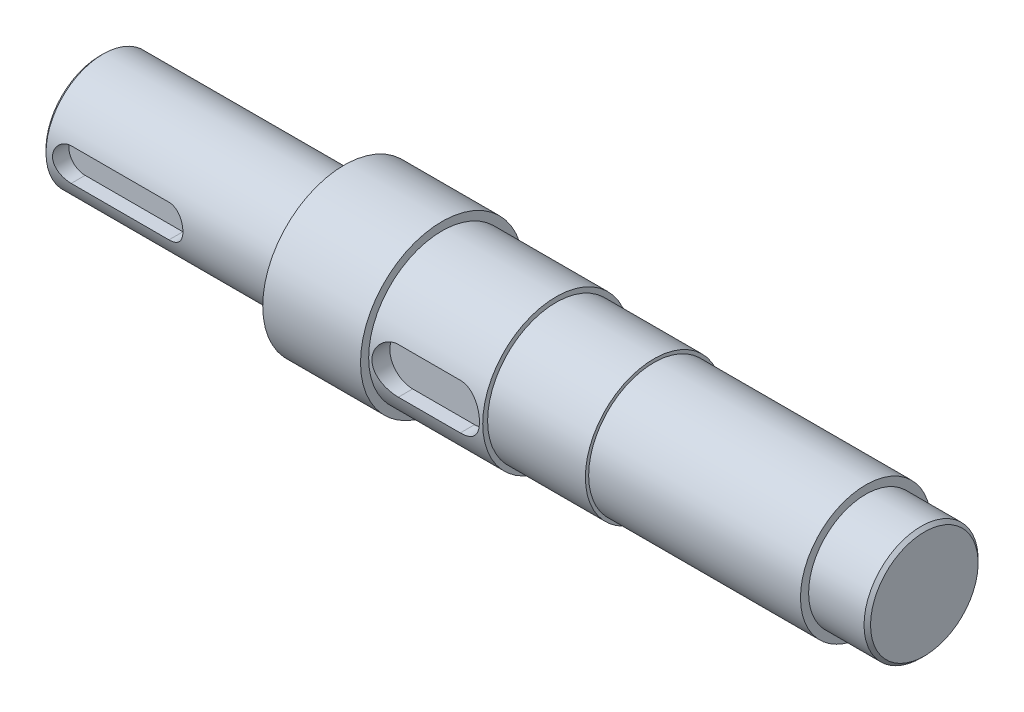
ISO-10303-21;
HEADER;
FILE_DESCRIPTION(('STEP AP214'),'2;1');
FILE_NAME('part.step','',(''),(''),'','','');
FILE_SCHEMA(('AUTOMOTIVE_DESIGN { 1 0 10303 214 1 1 1 1 }'));
ENDSEC;
DATA;
#1=APPLICATION_CONTEXT('core data for automotive mechanical design processes');
#2=APPLICATION_PROTOCOL_DEFINITION('international standard','automotive_design',2000,#1);
#3=PRODUCT_CONTEXT('',#1,'mechanical');
#4=PRODUCT('Part','Part','',(#3));
#5=PRODUCT_RELATED_PRODUCT_CATEGORY('part','',(#4));
#6=PRODUCT_DEFINITION_FORMATION('','',#4);
#7=PRODUCT_DEFINITION_CONTEXT('part definition',#1,'design');
#8=PRODUCT_DEFINITION('design','',#6,#7);
#9=PRODUCT_DEFINITION_SHAPE('','',#8);
#10=(LENGTH_UNIT() NAMED_UNIT(*) SI_UNIT(.MILLI.,.METRE.));
#11=(NAMED_UNIT(*) PLANE_ANGLE_UNIT() SI_UNIT($,.RADIAN.));
#12=(NAMED_UNIT(*) SI_UNIT($,.STERADIAN.) SOLID_ANGLE_UNIT());
#13=UNCERTAINTY_MEASURE_WITH_UNIT(LENGTH_MEASURE(1.E-05),#10,'distance_accuracy_value','');
#14=(GEOMETRIC_REPRESENTATION_CONTEXT(3) GLOBAL_UNCERTAINTY_ASSIGNED_CONTEXT((#13)) GLOBAL_UNIT_ASSIGNED_CONTEXT((#10,
#11,#12)) REPRESENTATION_CONTEXT('',''));
#15=CARTESIAN_POINT('',(0.,0.,0.));
#16=DIRECTION('',(0.,0.,1.));
#17=DIRECTION('',(1.,0.,0.));
#18=AXIS2_PLACEMENT_3D('',#15,#16,#17);
#19=CARTESIAN_POINT('',(0.,0.,0.));
#20=DIRECTION('',(-1.,0.,0.));
#21=DIRECTION('',(0.,0.,1.));
#22=AXIS2_PLACEMENT_3D('',#19,#20,#21);
#23=CYLINDRICAL_SURFACE('',#22,17.5);
#24=CARTESIAN_POINT('',(1.00000000000007,0.,0.));
#25=DIRECTION('',(1.,0.,0.));
#26=DIRECTION('',(0.,0.,-1.));
#27=AXIS2_PLACEMENT_3D('',#24,#25,#26);
#28=CIRCLE('',#27,17.5);
#29=CARTESIAN_POINT('',(1.00000000000007,0.,-17.5));
#30=VERTEX_POINT('',#29);
#31=EDGE_CURVE('E13',#30,#30,#28,.T.);
#32=ORIENTED_EDGE('',*,*,#31,.T.);
#33=EDGE_LOOP('',(#32));
#34=FACE_BOUND('',#33,.T.);
#35=CARTESIAN_POINT('',(75.,0.,0.));
#36=DIRECTION('',(-1.,0.,0.));
#37=DIRECTION('',(0.,0.,1.));
#38=AXIS2_PLACEMENT_3D('',#35,#36,#37);
#39=CIRCLE('',#38,17.5);
#40=CARTESIAN_POINT('',(75.,0.,17.5));
#41=VERTEX_POINT('',#40);
#42=EDGE_CURVE('E206',#41,#41,#39,.T.);
#43=ORIENTED_EDGE('',*,*,#42,.T.);
#44=EDGE_LOOP('',(#43));
#45=FACE_BOUND('',#44,.T.);
#46=CARTESIAN_POINT('',(8.,5.,16.7705098312484));
#47=CARTESIAN_POINT('',(7.86245623305314,5.00001814544053,16.7704912725158));
#48=CARTESIAN_POINT('',(7.7249193779771,4.99432529208164,16.7722013219269));
#49=CARTESIAN_POINT('',(7.45088881071556,4.97165222541634,16.7789431019967));
#50=CARTESIAN_POINT('',(7.31439488815721,4.95467435267923,16.7839741438635));
#51=CARTESIAN_POINT('',(7.04374154598052,4.90961903685605,16.7972068372471));
#52=CARTESIAN_POINT('',(6.90957737516665,4.88156789644729,16.8054009743523));
#53=CARTESIAN_POINT('',(6.64420035801123,4.81461674604718,16.8247046364186));
#54=CARTESIAN_POINT('',(6.51298757757802,4.77571649404059,16.8358142264156));
#55=CARTESIAN_POINT('',(6.25446833937773,4.68740449021953,16.8606149796878));
#56=CARTESIAN_POINT('',(6.12715994463595,4.63799805032664,16.874304837985));
#57=CARTESIAN_POINT('',(5.87720063727427,4.52905522001708,16.9038705765848));
#58=CARTESIAN_POINT('',(5.75455147662851,4.46951506432954,16.9197472690052));
#59=CARTESIAN_POINT('',(5.39479163969302,4.27631278448765,16.9699997678901));
#60=CARTESIAN_POINT('',(5.16570163810453,4.12801150136261,17.007014905076));
#61=CARTESIAN_POINT('',(4.72948603513064,3.79229915782691,17.0850471293107));
#62=CARTESIAN_POINT('',(4.52307972534301,3.60397767000144,17.1261428352533));
#63=CARTESIAN_POINT('',(4.14426230692643,3.19544341696382,17.2070462516998));
#64=CARTESIAN_POINT('',(3.97185683595896,2.97522537348191,17.2468537476932));
#65=CARTESIAN_POINT('',(3.66292190803247,2.5041085165938,17.3215844019062));
#66=CARTESIAN_POINT('',(3.52711907570153,2.25271539483174,17.3564029869975));
#67=CARTESIAN_POINT('',(3.29999228760769,1.72950937060037,17.4163145657263));
#68=CARTESIAN_POINT('',(3.20865769481189,1.45770136944961,17.4414098849257));
#69=CARTESIAN_POINT('',(3.07541429914927,0.908899275051305,17.4784878135792));
#70=CARTESIAN_POINT('',(3.03227814541031,0.632225504452073,17.4907954521753));
#71=CARTESIAN_POINT('',(2.99278330584537,0.0753060921048357,17.5020523750682));
#72=CARTESIAN_POINT('',(2.99641666900432,-0.204938934421978,17.5010039299558));
#73=CARTESIAN_POINT('',(3.04951548019445,-0.752451373530218,17.4859002467781));
#74=CARTESIAN_POINT('',(3.09765239927416,-1.0198597093415,17.4722220494947));
#75=CARTESIAN_POINT('',(3.23624082954846,-1.54263514692821,17.433846479088));
#76=CARTESIAN_POINT('',(3.32669447701044,-1.79800164008106,17.4091485496606));
#77=CARTESIAN_POINT('',(3.54826637126563,-2.29267928834748,17.3509771517082));
#78=CARTESIAN_POINT('',(3.6798189520825,-2.53178407311227,17.3174105731756));
#79=CARTESIAN_POINT('',(3.97964433357547,-2.98504901208547,17.2450626129451));
#80=CARTESIAN_POINT('',(4.14792458727652,-3.19920408978386,17.2062801734237));
#81=CARTESIAN_POINT('',(4.42762735882451,-3.50113424709606,17.1465202223136));
#82=CARTESIAN_POINT('',(4.52736386434642,-3.60007423743551,17.1259700648702));
#83=CARTESIAN_POINT('',(4.73482024233988,-3.78923134613091,17.0851123940087));
#84=CARTESIAN_POINT('',(4.84253733987009,-3.87945147156873,17.0648047990745));
#85=CARTESIAN_POINT('',(5.06534504099315,-4.05062437518906,17.0249868857383));
#86=CARTESIAN_POINT('',(5.18044052987208,-4.13157091233148,17.005477109874));
#87=CARTESIAN_POINT('',(5.41716079370095,-4.28353981460235,16.9678346429649));
#88=CARTESIAN_POINT('',(5.53878300333381,-4.35456603991598,16.9497014175386));
#89=CARTESIAN_POINT('',(5.78891595131824,-4.48679157824972,16.9151829895461));
#90=CARTESIAN_POINT('',(5.91747862779708,-4.5478971849676,16.898814896638));
#91=CARTESIAN_POINT('',(6.17954149635999,-4.65898872141545,16.8685251216221));
#92=CARTESIAN_POINT('',(6.31303965776124,-4.70897916633163,16.8546024466245));
#93=CARTESIAN_POINT('',(6.58392101135627,-4.79739484975374,16.829649854127));
#94=CARTESIAN_POINT('',(6.72129997925907,-4.83583217063301,16.8186169160755));
#95=CARTESIAN_POINT('',(6.99899554565236,-4.90084834749729,16.7997865631929));
#96=CARTESIAN_POINT('',(7.13931075151926,-4.92743269748005,16.7919876494693));
#97=CARTESIAN_POINT('',(7.39966511421258,-4.96528740578587,16.7808301521248));
#98=CARTESIAN_POINT('',(7.51943162972835,-4.97830600651658,16.776966894118));
#99=CARTESIAN_POINT('',(7.75946229481565,-4.99566040544728,16.7718034889731));
#100=CARTESIAN_POINT('',(7.87972540377703,-5.00000944654161,16.7704994326599));
#101=CARTESIAN_POINT('',(8.,-5.,16.7705098312484));
#102=B_SPLINE_CURVE_WITH_KNOTS('',3,(#46,#47,#48,#49,#50,#51,#52,#53,#54,#55,#56,#57,#58,#59,
#60,#61,#62,#63,#64,#65,#66,#67,#68,#69,#70,#71,#72,#73,#74,#75,#76,#77,#78,#79,#80,#81,#82,#83,
#84,#85,#86,#87,#88,#89,#90,#91,#92,#93,#94,#95,#96,#97,#98,#99,#100,#101),.UNSPECIFIED.,.F.,
.F.,(4,2,2,2,2,2,2,2,2,2,2,2,2,2,2,2,2,2,2,2,2,2,2,2,2,2,2,4),(0.,0.412492178804548,
0.82489883135798,1.23633171981252,1.64777378699039,2.05900832185038,2.47039598941263,
3.29264569343992,4.13611232627188,4.9797186965021,5.83900986868947,6.69809539287325,
7.53476732988532,8.3712970310193,9.18363381655588,9.99601161556285,10.8172828992968,
11.6387209961027,12.0642579015972,12.489647531354,12.9153217832844,13.3408299328975,
13.7701489130555,14.1992931759112,14.6279870611799,15.056482034464,15.4177510461265,
15.7784677892953),.UNSPECIFIED.);
#103=CARTESIAN_POINT('',(7.99999999999999,5.,16.7705098312484));
#104=VERTEX_POINT('',#103);
#105=CARTESIAN_POINT('',(8.,-5.,16.7705098312484));
#106=VERTEX_POINT('',#105);
#107=EDGE_CURVE('E129',#104,#106,#102,.T.);
#108=ORIENTED_EDGE('',*,*,#107,.F.);
#109=DIRECTION('',(-1.,0.,0.));
#110=VECTOR('',#109,1.);
#111=CARTESIAN_POINT('',(0.,5.,16.7705098312484));
#112=LINE('',#111,#110);
#113=CARTESIAN_POINT('',(38.,5.,16.7705098312484));
#114=VERTEX_POINT('',#113);
#115=EDGE_CURVE('E250',#114,#104,#112,.T.);
#116=ORIENTED_EDGE('',*,*,#115,.F.);
#117=CARTESIAN_POINT('',(38.,-4.99999999999999,16.7705098312484));
#118=CARTESIAN_POINT('',(38.1375437669468,-5.00001814544052,16.7704912725158));
#119=CARTESIAN_POINT('',(38.2750806220229,-4.99432529208163,16.7722013219269));
#120=CARTESIAN_POINT('',(38.5491111892844,-4.97165222541633,16.7789431019967));
#121=CARTESIAN_POINT('',(38.6856051118428,-4.95467435267922,16.7839741438635));
#122=CARTESIAN_POINT('',(38.9562584540195,-4.90961903685604,16.7972068372471));
#123=CARTESIAN_POINT('',(39.0904226248333,-4.88156789644728,16.8054009743523));
#124=CARTESIAN_POINT('',(39.3557996419888,-4.81461674604717,16.8247046364186));
#125=CARTESIAN_POINT('',(39.487012422422,-4.77571649404058,16.8358142264156));
#126=CARTESIAN_POINT('',(39.7455316606223,-4.68740449021953,16.8606149796878));
#127=CARTESIAN_POINT('',(39.872840055364,-4.63799805032663,16.874304837985));
#128=CARTESIAN_POINT('',(40.1227993627257,-4.52905522001708,16.9038705765848));
#129=CARTESIAN_POINT('',(40.2454485233715,-4.46951506432953,16.9197472690052));
#130=CARTESIAN_POINT('',(40.605208360307,-4.27631278448764,16.9699997678901));
#131=CARTESIAN_POINT('',(40.8342983618954,-4.12801150136261,17.007014905076));
#132=CARTESIAN_POINT('',(41.2705139648693,-3.7922991578269,17.0850471293107));
#133=CARTESIAN_POINT('',(41.476920274657,-3.60397767000144,17.1261428352533));
#134=CARTESIAN_POINT('',(41.8557376930736,-3.19544341696382,17.2070462516998));
#135=CARTESIAN_POINT('',(42.028143164041,-2.97522537348191,17.2468537476932));
#136=CARTESIAN_POINT('',(42.3370780919675,-2.5041085165938,17.3215844019063));
#137=CARTESIAN_POINT('',(42.4728809242985,-2.25271539483174,17.3564029869975));
#138=CARTESIAN_POINT('',(42.7000077123923,-1.72950937060036,17.4163145657263));
#139=CARTESIAN_POINT('',(42.7913423051881,-1.4577013694496,17.4414098849257));
#140=CARTESIAN_POINT('',(42.9245857008507,-0.908899275051296,17.4784878135792));
#141=CARTESIAN_POINT('',(42.9677218545897,-0.632225504452064,17.4907954521753));
#142=CARTESIAN_POINT('',(43.0072166941546,-0.0753060921048292,17.5020523750682));
#143=CARTESIAN_POINT('',(43.0035833309957,0.204938934421983,17.5010039299558));
#144=CARTESIAN_POINT('',(42.9504845198055,0.752451373530223,17.4859002467781));
#145=CARTESIAN_POINT('',(42.9023476007258,1.0198597093415,17.4722220494947));
#146=CARTESIAN_POINT('',(42.7637591704515,1.54263514692822,17.433846479088));
#147=CARTESIAN_POINT('',(42.6733055229896,1.79800164008106,17.4091485496606));
#148=CARTESIAN_POINT('',(42.4517336287344,2.29267928834748,17.3509771517082));
#149=CARTESIAN_POINT('',(42.3201810479175,2.53178407311228,17.3174105731756));
#150=CARTESIAN_POINT('',(42.0203556664245,2.98504901208547,17.2450626129451));
#151=CARTESIAN_POINT('',(41.8520754127235,3.19920408978387,17.2062801734237));
#152=CARTESIAN_POINT('',(41.5723726411755,3.50113424709606,17.1465202223136));
#153=CARTESIAN_POINT('',(41.4726361356536,3.60007423743551,17.1259700648702));
#154=CARTESIAN_POINT('',(41.2651797576601,3.78923134613092,17.0851123940087));
#155=CARTESIAN_POINT('',(41.1574626601299,3.87945147156873,17.0648047990745));
#156=CARTESIAN_POINT('',(40.9346549590068,4.05062437518907,17.0249868857383));
#157=CARTESIAN_POINT('',(40.8195594701279,4.13157091233149,17.005477109874));
#158=CARTESIAN_POINT('',(40.582839206299,4.28353981460236,16.9678346429649));
#159=CARTESIAN_POINT('',(40.4612169966662,4.35456603991599,16.9497014175386));
#160=CARTESIAN_POINT('',(40.2110840486817,4.48679157824973,16.9151829895461));
#161=CARTESIAN_POINT('',(40.0825213722029,4.5478971849676,16.898814896638));
#162=CARTESIAN_POINT('',(39.82045850364,4.65898872141545,16.8685251216221));
#163=CARTESIAN_POINT('',(39.6869603422387,4.70897916633163,16.8546024466245));
#164=CARTESIAN_POINT('',(39.4160789886437,4.79739484975374,16.829649854127));
#165=CARTESIAN_POINT('',(39.2787000207409,4.83583217063301,16.8186169160755));
#166=CARTESIAN_POINT('',(39.0010044543476,4.90084834749729,16.7997865631929));
#167=CARTESIAN_POINT('',(38.8606892484807,4.92743269748006,16.7919876494693));
#168=CARTESIAN_POINT('',(38.6003348857874,4.96528740578588,16.7808301521248));
#169=CARTESIAN_POINT('',(38.4805683702716,4.97830600651659,16.776966894118));
#170=CARTESIAN_POINT('',(38.2405377051843,4.99566040544728,16.7718034889731));
#171=CARTESIAN_POINT('',(38.120274596223,5.00000944654162,16.7704994326599));
#172=CARTESIAN_POINT('',(38.,5.00000000000001,16.7705098312484));
#173=B_SPLINE_CURVE_WITH_KNOTS('',3,(#117,#118,#119,#120,#121,#122,#123,#124,#125,#126,#127,
#128,#129,#130,#131,#132,#133,#134,#135,#136,#137,#138,#139,#140,#141,#142,#143,#144,#145,#146,
#147,#148,#149,#150,#151,#152,#153,#154,#155,#156,#157,#158,#159,#160,#161,#162,#163,#164,#165,
#166,#167,#168,#169,#170,#171,#172),.UNSPECIFIED.,.F.,.F.,(4,2,2,2,2,2,2,2,2,2,2,2,2,2,2,2,2,2,
2,2,2,2,2,2,2,2,2,4),(0.,0.412492178804547,0.824898831357982,1.23633171981251,1.64777378699039,
2.05900832185038,2.47039598941262,3.29264569343991,4.13611232627187,4.97971869650209,
5.83900986868947,6.69809539287325,7.53476732988532,8.3712970310193,9.18363381655588,
9.99601161556285,10.8172828992968,11.6387209961027,12.0642579015972,12.489647531354,
12.9153217832844,13.3408299328975,13.7701489130555,14.1992931759112,14.6279870611799,
15.056482034464,15.4177510461265,15.7784677892953),.UNSPECIFIED.);
#174=CARTESIAN_POINT('',(38.,-4.99999999999999,16.7705098312484));
#175=VERTEX_POINT('',#174);
#176=EDGE_CURVE('E252',#175,#114,#173,.T.);
#177=ORIENTED_EDGE('',*,*,#176,.F.);
#178=DIRECTION('',(-1.,0.,0.));
#179=VECTOR('',#178,1.);
#180=CARTESIAN_POINT('',(0.,-5.,16.7705098312484));
#181=LINE('',#180,#179);
#182=EDGE_CURVE('E260',#106,#175,#181,.F.);
#183=ORIENTED_EDGE('',*,*,#182,.F.);
#184=EDGE_LOOP('',(#108,#116,#177,#183));
#185=FACE_BOUND('',#184,.T.);
#186=ADVANCED_FACE('F54',(#34,#45,#185),#23,.T.);
#187=CARTESIAN_POINT('',(0.,0.,0.));
#188=DIRECTION('',(-1.,0.,0.));
#189=DIRECTION('',(0.,0.,1.));
#190=AXIS2_PLACEMENT_3D('',#187,#188,#189);
#191=CYLINDRICAL_SURFACE('',#190,22.5);
#192=CARTESIAN_POINT('',(140.,0.,0.));
#193=DIRECTION('',(-1.,0.,0.));
#194=DIRECTION('',(0.,0.,1.));
#195=AXIS2_PLACEMENT_3D('',#192,#193,#194);
#196=CIRCLE('',#195,22.5);
#197=CARTESIAN_POINT('',(140.,0.,22.5));
#198=VERTEX_POINT('',#197);
#199=EDGE_CURVE('E194',#198,#198,#196,.T.);
#200=ORIENTED_EDGE('',*,*,#199,.T.);
#201=EDGE_LOOP('',(#200));
#202=FACE_BOUND('',#201,.T.);
#203=CARTESIAN_POINT('',(105.,0.,0.));
#204=DIRECTION('',(-1.,0.,0.));
#205=DIRECTION('',(0.,0.,1.));
#206=AXIS2_PLACEMENT_3D('',#203,#204,#205);
#207=CIRCLE('',#206,22.5);
#208=CARTESIAN_POINT('',(105.,0.,22.5));
#209=VERTEX_POINT('',#208);
#210=EDGE_CURVE('E197',#209,#209,#207,.T.);
#211=ORIENTED_EDGE('',*,*,#210,.F.);
#212=EDGE_LOOP('',(#211));
#213=FACE_BOUND('',#212,.T.);
#214=CARTESIAN_POINT('',(113.,7.00000000000001,21.3834047803431));
#215=CARTESIAN_POINT('',(112.808252037067,7.00002638788775,21.3833759755726));
#216=CARTESIAN_POINT('',(112.616514678496,6.99212250357734,21.3859829575454));
#217=CARTESIAN_POINT('',(112.234510941038,6.96064990633985,21.3962580072183));
#218=CARTESIAN_POINT('',(112.044244221345,6.93708493994705,21.4039248644627));
#219=CARTESIAN_POINT('',(111.667041896898,6.87456915635528,21.4240824611325));
#220=CARTESIAN_POINT('',(111.480098764527,6.83565951993688,21.4365602872848));
#221=CARTESIAN_POINT('',(111.11033770445,6.74281154744469,21.4659469063578));
#222=CARTESIAN_POINT('',(110.927519897856,6.68887277075808,21.4828558291851));
#223=CARTESIAN_POINT('',(110.567371826461,6.56646575510686,21.5205859002674));
#224=CARTESIAN_POINT('',(110.390038032618,6.49800709263034,21.5414044689111));
#225=CARTESIAN_POINT('',(110.041810029977,6.34705748516685,21.5863628741254));
#226=CARTESIAN_POINT('',(109.870918240388,6.26456133146707,21.6105039428957));
#227=CARTESIAN_POINT('',(109.536677020075,6.08615523684721,21.6614246049304));
#228=CARTESIAN_POINT('',(109.373328439049,5.9902437896497,21.6882044943833));
#229=CARTESIAN_POINT('',(109.055107259177,5.78563893862383,21.7436799451747));
#230=CARTESIAN_POINT('',(108.900237725576,5.67694095648715,21.7723761910783));
#231=CARTESIAN_POINT('',(108.595350121049,5.44398558349855,21.8318094528287));
#232=CARTESIAN_POINT('',(108.445624302328,5.3193546126356,21.8625820218381));
#233=CARTESIAN_POINT('',(108.157114741691,5.0580962557251,21.9244995602667));
#234=CARTESIAN_POINT('',(108.018331183725,4.92146866808489,21.9556445359364));
#235=CARTESIAN_POINT('',(107.752530716931,4.63702147167285,22.0174752796029));
#236=CARTESIAN_POINT('',(107.625517889775,4.48919801262158,22.0481608852367));
#237=CARTESIAN_POINT('',(107.384184881425,4.18336601580317,22.1082274768052));
#238=CARTESIAN_POINT('',(107.269860286297,4.02536105036418,22.1376089142809));
#239=CARTESIAN_POINT('',(107.05217986568,3.69637926494413,22.1949382761817));
#240=CARTESIAN_POINT('',(106.949134197864,3.52518859648672,22.222838133295));
#241=CARTESIAN_POINT('',(106.757922603966,3.17432985879875,22.2756613074277));
#242=CARTESIAN_POINT('',(106.66975122526,2.99466492710901,22.3005857142056));
#243=CARTESIAN_POINT('',(106.508972494321,2.62804567748409,22.3467560378169));
#244=CARTESIAN_POINT('',(106.436364720049,2.44109155737345,22.3680020543947));
#245=CARTESIAN_POINT('',(106.307355584982,2.06124657398029,22.4061975627029));
#246=CARTESIAN_POINT('',(106.250953624843,1.86835593054218,22.4231472133242));
#247=CARTESIAN_POINT('',(106.156354205992,1.48406965496815,22.4518043567541));
#248=CARTESIAN_POINT('',(106.117652557385,1.29280885191945,22.4636563728524));
#249=CARTESIAN_POINT('',(106.056333016079,0.907492281435949,22.4825189363242));
#250=CARTESIAN_POINT('',(106.033714568578,0.713436610647603,22.4895296507013));
#251=CARTESIAN_POINT('',(106.004778928817,0.324029619574419,22.4985094688896));
#252=CARTESIAN_POINT('',(105.998459028392,0.128678519946834,22.5004794102745));
#253=CARTESIAN_POINT('',(106.002174375331,-0.261850976266964,22.4993235348161));
#254=CARTESIAN_POINT('',(106.012209297703,-0.457029376207825,22.4961978192299));
#255=CARTESIAN_POINT('',(106.047908720752,-0.839016651756683,22.4851350756934));
#256=CARTESIAN_POINT('',(106.073022801591,-1.02588219704708,22.4773675290497));
#257=CARTESIAN_POINT('',(106.138193284498,-1.39681014394022,22.4573691656826));
#258=CARTESIAN_POINT('',(106.178254673333,-1.58087158867604,22.4451368594423));
#259=CARTESIAN_POINT('',(106.272959228968,-1.9448049822526,22.4165350301791));
#260=CARTESIAN_POINT('',(106.327597533496,-2.12467830636908,22.4001668868012));
#261=CARTESIAN_POINT('',(106.451037791668,-2.47918052521275,22.3637078769714));
#262=CARTESIAN_POINT('',(106.519845077846,-2.65380741699502,22.3436156092208));
#263=CARTESIAN_POINT('',(106.671972689785,-2.99866751070752,22.2999677081418));
#264=CARTESIAN_POINT('',(106.755454750099,-3.1688245114741,22.2763739905048));
#265=CARTESIAN_POINT('',(106.935773489155,-3.50156811170553,22.2265007734939));
#266=CARTESIAN_POINT('',(107.032614746862,-3.66415208979078,22.2002203540359));
#267=CARTESIAN_POINT('',(107.238961369497,-3.98072025747786,22.1456467231703));
#268=CARTESIAN_POINT('',(107.348467048102,-4.13470423393204,22.1173534619146));
#269=CARTESIAN_POINT('',(107.579429803897,-4.43317367604058,22.0594670226099));
#270=CARTESIAN_POINT('',(107.700887257273,-4.57765884247861,22.0298738036607));
#271=CARTESIAN_POINT('',(107.960275290005,-4.86207108102336,21.9688936108202));
#272=CARTESIAN_POINT('',(108.098679960612,-5.0015610920034,21.9374831254957));
#273=CARTESIAN_POINT('',(108.386705813661,-5.26840074524966,21.8749338799794));
#274=CARTESIAN_POINT('',(108.536323404815,-5.39575424517761,21.8437950363228));
#275=CARTESIAN_POINT('',(108.845983359765,-5.63762072887126,21.7826262792731));
#276=CARTESIAN_POINT('',(109.006032679353,-5.75212500350361,21.7525971271591));
#277=CARTESIAN_POINT('',(109.335396200148,-5.96735827855912,21.6945398510365));
#278=CARTESIAN_POINT('',(109.504706758428,-6.06809264161729,21.6665109500826));
#279=CARTESIAN_POINT('',(109.85364568721,-6.2562135567731,21.6129469743072));
#280=CARTESIAN_POINT('',(110.033373337995,-6.34342581409756,21.5874457842966));
#281=CARTESIAN_POINT('',(110.39996563282,-6.50228494842816,21.5401290954628));
#282=CARTESIAN_POINT('',(110.586827303704,-6.57393822826234,21.5183120813529));
#283=CARTESIAN_POINT('',(110.966217137913,-6.70102264969049,21.4790763704547));
#284=CARTESIAN_POINT('',(111.158739039416,-6.75647102650281,21.4616530033951));
#285=CARTESIAN_POINT('',(111.548114051872,-6.85070294339747,21.4317592713336));
#286=CARTESIAN_POINT('',(111.744965128001,-6.88949414394961,21.4192866297424));
#287=CARTESIAN_POINT('',(112.118007410846,-6.94646198663146,21.4008759333036));
#288=CARTESIAN_POINT('',(112.293881560783,-6.9665371858529,21.3943385336146));
#289=CARTESIAN_POINT('',(112.646499342341,-6.99330547974963,21.3855959359006));
#290=CARTESIAN_POINT('',(112.823241381678,-7.00001756560226,21.3833845899213));
#291=CARTESIAN_POINT('',(113.,-6.99999999999999,21.3834047803431));
#292=B_SPLINE_CURVE_WITH_KNOTS('',3,(#214,#215,#216,#217,#218,#219,#220,#221,#222,#223,#224,
#225,#226,#227,#228,#229,#230,#231,#232,#233,#234,#235,#236,#237,#238,#239,#240,#241,#242,#243,
#244,#245,#246,#247,#248,#249,#250,#251,#252,#253,#254,#255,#256,#257,#258,#259,#260,#261,#262,
#263,#264,#265,#266,#267,#268,#269,#270,#271,#272,#273,#274,#275,#276,#277,#278,#279,#280,#281,
#282,#283,#284,#285,#286,#287,#288,#289,#290,#291),.UNSPECIFIED.,.F.,.F.,(4,2,2,2,2,2,2,2,2,2,2,
2,2,2,2,2,2,2,2,2,2,2,2,2,2,2,2,2,2,2,2,2,2,2,2,2,2,2,4),(0.,0.575046969806877,1.14995642305859,
1.72333336736907,2.29672712327433,2.86974387087759,3.44297370600941,4.01626795548503,
4.58976810539893,5.18076864034277,5.77177910843487,6.3629937570856,6.95400208730354,
7.55850874723001,8.16279332293318,8.76706151008844,9.37130734653416,9.95706552574568,
10.5428034978567,11.1284441375358,11.7140731399452,12.2795246614735,12.8451649995772,
13.4106168982253,13.9762819963941,14.5486246379559,15.1211639439558,15.6937174338258,
16.2662889507273,16.8625896714317,17.4587002177891,18.055212394766,18.6514915966369,
19.2549115963138,19.8580828040918,20.460610136413,21.0628600748604,21.5937197869136,
22.1238245201084),.UNSPECIFIED.);
#293=CARTESIAN_POINT('',(113.,7.00000000000001,21.3834047803431));
#294=VERTEX_POINT('',#293);
#295=CARTESIAN_POINT('',(113.,-6.99999999999999,21.3834047803431));
#296=VERTEX_POINT('',#295);
#297=EDGE_CURVE('E244',#294,#296,#292,.T.);
#298=ORIENTED_EDGE('',*,*,#297,.F.);
#299=DIRECTION('',(-1.,0.,0.));
#300=VECTOR('',#299,1.);
#301=CARTESIAN_POINT('',(0.,6.99999999999997,21.3834047803431));
#302=LINE('',#301,#300);
#303=CARTESIAN_POINT('',(132.,6.99999999999997,21.3834047803431));
#304=VERTEX_POINT('',#303);
#305=EDGE_CURVE('E209',#304,#294,#302,.T.);
#306=ORIENTED_EDGE('',*,*,#305,.F.);
#307=CARTESIAN_POINT('',(132.,-6.99999999999998,21.3834047803431));
#308=CARTESIAN_POINT('',(132.191747962933,-7.00002638788771,21.3833759755726));
#309=CARTESIAN_POINT('',(132.383485321504,-6.99212250357731,21.3859829575454));
#310=CARTESIAN_POINT('',(132.765489058962,-6.96064990633982,21.3962580072183));
#311=CARTESIAN_POINT('',(132.955755778655,-6.93708493994701,21.4039248644627));
#312=CARTESIAN_POINT('',(133.332958103102,-6.87456915635525,21.4240824611325));
#313=CARTESIAN_POINT('',(133.519901235473,-6.83565951993685,21.4365602872848));
#314=CARTESIAN_POINT('',(133.88966229555,-6.74281154744466,21.4659469063578));
#315=CARTESIAN_POINT('',(134.072480102144,-6.68887277075805,21.4828558291851));
#316=CARTESIAN_POINT('',(134.432628173539,-6.56646575510683,21.5205859002674));
#317=CARTESIAN_POINT('',(134.609961967382,-6.49800709263031,21.5414044689111));
#318=CARTESIAN_POINT('',(134.958189970023,-6.34705748516683,21.5863628741255));
#319=CARTESIAN_POINT('',(135.129081759612,-6.26456133146704,21.6105039428958));
#320=CARTESIAN_POINT('',(135.463322979925,-6.08615523684718,21.6614246049305));
#321=CARTESIAN_POINT('',(135.626671560951,-5.99024378964968,21.6882044943834));
#322=CARTESIAN_POINT('',(135.944892740823,-5.78563893862381,21.7436799451747));
#323=CARTESIAN_POINT('',(136.099762274424,-5.67694095648712,21.7723761910783));
#324=CARTESIAN_POINT('',(136.404649878951,-5.44398558349851,21.8318094528287));
#325=CARTESIAN_POINT('',(136.554375697672,-5.31935461263557,21.8625820218381));
#326=CARTESIAN_POINT('',(136.842885258309,-5.05809625572507,21.9244995602668));
#327=CARTESIAN_POINT('',(136.981668816275,-4.92146866808486,21.9556445359364));
#328=CARTESIAN_POINT('',(137.247469283069,-4.63702147167282,22.0174752796029));
#329=CARTESIAN_POINT('',(137.374482110225,-4.48919801262154,22.0481608852367));
#330=CARTESIAN_POINT('',(137.615815118575,-4.18336601580313,22.1082274768052));
#331=CARTESIAN_POINT('',(137.730139713703,-4.02536105036415,22.1376089142809));
#332=CARTESIAN_POINT('',(137.94782013432,-3.6963792649441,22.1949382761817));
#333=CARTESIAN_POINT('',(138.050865802136,-3.52518859648669,22.222838133295));
#334=CARTESIAN_POINT('',(138.242077396034,-3.17432985879872,22.2756613074277));
#335=CARTESIAN_POINT('',(138.33024877474,-2.99466492710898,22.3005857142056));
#336=CARTESIAN_POINT('',(138.491027505679,-2.62804567748407,22.3467560378169));
#337=CARTESIAN_POINT('',(138.563635279951,-2.44109155737342,22.3680020543947));
#338=CARTESIAN_POINT('',(138.692644415018,-2.06124657398026,22.4061975627029));
#339=CARTESIAN_POINT('',(138.749046375157,-1.86835593054214,22.4231472133242));
#340=CARTESIAN_POINT('',(138.843645794008,-1.48406965496812,22.4518043567541));
#341=CARTESIAN_POINT('',(138.882347442615,-1.29280885191942,22.4636563728524));
#342=CARTESIAN_POINT('',(138.943666983921,-0.907492281435916,22.4825189363242));
#343=CARTESIAN_POINT('',(138.966285431422,-0.713436610647569,22.4895296507013));
#344=CARTESIAN_POINT('',(138.995221071183,-0.324029619574386,22.4985094688896));
#345=CARTESIAN_POINT('',(139.001540971608,-0.128678519946802,22.5004794102745));
#346=CARTESIAN_POINT('',(138.997825624669,0.261850976266994,22.4993235348161));
#347=CARTESIAN_POINT('',(138.987790702297,0.457029376207853,22.4961978192299));
#348=CARTESIAN_POINT('',(138.952091279248,0.839016651756709,22.4851350756934));
#349=CARTESIAN_POINT('',(138.926977198409,1.02588219704711,22.4773675290497));
#350=CARTESIAN_POINT('',(138.861806715502,1.39681014394024,22.4573691656826));
#351=CARTESIAN_POINT('',(138.821745326667,1.58087158867606,22.4451368594423));
#352=CARTESIAN_POINT('',(138.727040771032,1.94480498225262,22.4165350301791));
#353=CARTESIAN_POINT('',(138.672402466504,2.1246783063691,22.4001668868012));
#354=CARTESIAN_POINT('',(138.548962208332,2.47918052521278,22.3637078769714));
#355=CARTESIAN_POINT('',(138.480154922154,2.65380741699505,22.3436156092208));
#356=CARTESIAN_POINT('',(138.328027310215,2.99866751070756,22.2999677081418));
#357=CARTESIAN_POINT('',(138.244545249901,3.16882451147414,22.2763739905048));
#358=CARTESIAN_POINT('',(138.064226510845,3.50156811170557,22.2265007734939));
#359=CARTESIAN_POINT('',(137.967385253138,3.66415208979082,22.2002203540359));
#360=CARTESIAN_POINT('',(137.761038630503,3.98072025747792,22.1456467231703));
#361=CARTESIAN_POINT('',(137.651532951898,4.1347042339321,22.1173534619146));
#362=CARTESIAN_POINT('',(137.420570196103,4.43317367604063,22.0594670226099));
#363=CARTESIAN_POINT('',(137.299112742727,4.57765884247865,22.0298738036607));
#364=CARTESIAN_POINT('',(137.039724709995,4.8620710810234,21.9688936108202));
#365=CARTESIAN_POINT('',(136.901320039388,5.00156109200343,21.9374831254957));
#366=CARTESIAN_POINT('',(136.613294186339,5.26840074524969,21.8749338799794));
#367=CARTESIAN_POINT('',(136.463676595185,5.39575424517765,21.8437950363228));
#368=CARTESIAN_POINT('',(136.154016640235,5.6376207288713,21.7826262792731));
#369=CARTESIAN_POINT('',(135.993967320647,5.75212500350365,21.7525971271591));
#370=CARTESIAN_POINT('',(135.664603799852,5.96735827855916,21.6945398510365));
#371=CARTESIAN_POINT('',(135.495293241572,6.06809264161732,21.6665109500826));
#372=CARTESIAN_POINT('',(135.14635431279,6.25621355677313,21.6129469743072));
#373=CARTESIAN_POINT('',(134.966626662005,6.34342581409759,21.5874457842966));
#374=CARTESIAN_POINT('',(134.60003436718,6.50228494842819,21.5401290954628));
#375=CARTESIAN_POINT('',(134.413172696296,6.57393822826238,21.5183120813529));
#376=CARTESIAN_POINT('',(134.033782862087,6.70102264969053,21.4790763704547));
#377=CARTESIAN_POINT('',(133.841260960584,6.75647102650285,21.4616530033951));
#378=CARTESIAN_POINT('',(133.451885948128,6.85070294339751,21.4317592713336));
#379=CARTESIAN_POINT('',(133.255034871999,6.88949414394964,21.4192866297424));
#380=CARTESIAN_POINT('',(132.881992589154,6.9464619866315,21.4008759333036));
#381=CARTESIAN_POINT('',(132.706118439217,6.96653718585293,21.3943385336146));
#382=CARTESIAN_POINT('',(132.353500657659,6.99330547974966,21.3855959359006));
#383=CARTESIAN_POINT('',(132.176758618322,7.00001756560229,21.3833845899213));
#384=CARTESIAN_POINT('',(132.,7.00000000000002,21.3834047803431));
#385=B_SPLINE_CURVE_WITH_KNOTS('',3,(#307,#308,#309,#310,#311,#312,#313,#314,#315,#316,#317,
#318,#319,#320,#321,#322,#323,#324,#325,#326,#327,#328,#329,#330,#331,#332,#333,#334,#335,#336,
#337,#338,#339,#340,#341,#342,#343,#344,#345,#346,#347,#348,#349,#350,#351,#352,#353,#354,#355,
#356,#357,#358,#359,#360,#361,#362,#363,#364,#365,#366,#367,#368,#369,#370,#371,#372,#373,#374,
#375,#376,#377,#378,#379,#380,#381,#382,#383,#384),.UNSPECIFIED.,.F.,.F.,(4,2,2,2,2,2,2,2,2,2,2,
2,2,2,2,2,2,2,2,2,2,2,2,2,2,2,2,2,2,2,2,2,2,2,2,2,2,2,4),(0.,0.575046969806849,1.1499564230586,
1.72333336736907,2.29672712327433,2.86974387087756,3.4429737060094,4.016267955485,
4.58976810539892,5.18076864034278,5.77177910843486,6.3629937570856,6.95400208730354,
7.55850874723,8.16279332293318,8.76706151008844,9.37130734653417,9.95706552574568,
10.5428034978567,11.1284441375358,11.7140731399452,12.2795246614735,12.8451649995771,
13.4106168982253,13.9762819963941,14.548624637956,15.1211639439559,15.6937174338259,
16.2662889507273,16.8625896714317,17.4587002177891,18.055212394766,18.6514915966369,
19.2549115963138,19.8580828040918,20.4606101364131,21.0628600748605,21.5937197869136,
22.1238245201084),.UNSPECIFIED.);
#386=CARTESIAN_POINT('',(132.,-6.99999999999998,21.3834047803431));
#387=VERTEX_POINT('',#386);
#388=EDGE_CURVE('E211',#387,#304,#385,.T.);
#389=ORIENTED_EDGE('',*,*,#388,.F.);
#390=DIRECTION('',(-1.,0.,0.));
#391=VECTOR('',#390,1.);
#392=CARTESIAN_POINT('',(0.,-7.00000000000001,21.3834047803431));
#393=LINE('',#392,#391);
#394=EDGE_CURVE('E219',#296,#387,#393,.F.);
#395=ORIENTED_EDGE('',*,*,#394,.F.);
#396=EDGE_LOOP('',(#298,#306,#389,#395));
#397=FACE_BOUND('',#396,.T.);
#398=ADVANCED_FACE('F221',(#202,#213,#397),#191,.T.);
#399=CARTESIAN_POINT('',(0.,0.,0.));
#400=DIRECTION('',(1.,0.,0.));
#401=DIRECTION('',(0.,0.,-1.));
#402=AXIS2_PLACEMENT_3D('',#399,#400,#401);
#403=PLANE('',#402);
#404=CARTESIAN_POINT('',(0.,0.,0.));
#405=DIRECTION('',(1.,0.,0.));
#406=DIRECTION('',(0.,0.,-1.));
#407=AXIS2_PLACEMENT_3D('',#404,#405,#406);
#408=CIRCLE('',#407,16.4999999999999);
#409=CARTESIAN_POINT('',(0.,0.,-16.4999999999999));
#410=VERTEX_POINT('',#409);
#411=EDGE_CURVE('E62',#410,#410,#408,.F.);
#412=ORIENTED_EDGE('',*,*,#411,.T.);
#413=EDGE_LOOP('',(#412));
#414=FACE_BOUND('',#413,.T.);
#415=CARTESIAN_POINT('',(0.,0.,0.));
#416=DIRECTION('',(-1.,0.,0.));
#417=DIRECTION('',(0.,0.,1.));
#418=AXIS2_PLACEMENT_3D('',#415,#416,#417);
#419=CIRCLE('',#418,2.49999999999999);
#420=CARTESIAN_POINT('',(0.,0.,2.49999999999999));
#421=VERTEX_POINT('',#420);
#422=EDGE_CURVE('E173',#421,#421,#419,.T.);
#423=ORIENTED_EDGE('',*,*,#422,.F.);
#424=EDGE_LOOP('',(#423));
#425=FACE_BOUND('',#424,.T.);
#426=ADVANCED_FACE('F291',(#414,#425),#403,.F.);
#427=CARTESIAN_POINT('',(75.,17.5,0.));
#428=DIRECTION('',(1.,0.,0.));
#429=DIRECTION('',(0.,0.,-1.));
#430=AXIS2_PLACEMENT_3D('',#427,#428,#429);
#431=PLANE('',#430);
#432=ORIENTED_EDGE('',*,*,#42,.F.);
#433=EDGE_LOOP('',(#432));
#434=FACE_BOUND('',#433,.T.);
#435=CARTESIAN_POINT('',(75.,0.,0.));
#436=DIRECTION('',(-1.,0.,0.));
#437=DIRECTION('',(0.,0.,1.));
#438=AXIS2_PLACEMENT_3D('',#435,#436,#437);
#439=CIRCLE('',#438,25.);
#440=CARTESIAN_POINT('',(75.,0.,25.));
#441=VERTEX_POINT('',#440);
#442=EDGE_CURVE('E203',#441,#441,#439,.T.);
#443=ORIENTED_EDGE('',*,*,#442,.T.);
#444=EDGE_LOOP('',(#443));
#445=FACE_BOUND('',#444,.T.);
#446=ADVANCED_FACE('F416',(#434,#445),#431,.F.);
#447=CARTESIAN_POINT('',(0.,0.,0.));
#448=DIRECTION('',(-1.,0.,0.));
#449=DIRECTION('',(0.,0.,1.));
#450=AXIS2_PLACEMENT_3D('',#447,#448,#449);
#451=CYLINDRICAL_SURFACE('',#450,25.);
#452=ORIENTED_EDGE('',*,*,#442,.F.);
#453=EDGE_LOOP('',(#452));
#454=FACE_BOUND('',#453,.T.);
#455=CARTESIAN_POINT('',(105.,0.,0.));
#456=DIRECTION('',(-1.,0.,0.));
#457=DIRECTION('',(0.,0.,1.));
#458=AXIS2_PLACEMENT_3D('',#455,#456,#457);
#459=CIRCLE('',#458,25.);
#460=CARTESIAN_POINT('',(105.,0.,25.));
#461=VERTEX_POINT('',#460);
#462=EDGE_CURVE('E200',#461,#461,#459,.T.);
#463=ORIENTED_EDGE('',*,*,#462,.T.);
#464=EDGE_LOOP('',(#463));
#465=FACE_BOUND('',#464,.T.);
#466=ADVANCED_FACE('F409',(#454,#465),#451,.T.);
#467=CARTESIAN_POINT('',(105.,25.,0.));
#468=DIRECTION('',(-1.,0.,0.));
#469=DIRECTION('',(0.,0.,1.));
#470=AXIS2_PLACEMENT_3D('',#467,#468,#469);
#471=PLANE('',#470);
#472=ORIENTED_EDGE('',*,*,#462,.F.);
#473=EDGE_LOOP('',(#472));
#474=FACE_BOUND('',#473,.T.);
#475=ORIENTED_EDGE('',*,*,#210,.T.);
#476=EDGE_LOOP('',(#475));
#477=FACE_BOUND('',#476,.T.);
#478=ADVANCED_FACE('F402',(#474,#477),#471,.F.);
#479=CARTESIAN_POINT('',(140.,22.5,0.));
#480=DIRECTION('',(-1.,0.,0.));
#481=DIRECTION('',(0.,0.,1.));
#482=AXIS2_PLACEMENT_3D('',#479,#480,#481);
#483=PLANE('',#482);
#484=ORIENTED_EDGE('',*,*,#199,.F.);
#485=EDGE_LOOP('',(#484));
#486=FACE_BOUND('',#485,.T.);
#487=CARTESIAN_POINT('',(140.,0.,0.));
#488=DIRECTION('',(-1.,0.,0.));
#489=DIRECTION('',(0.,0.,1.));
#490=AXIS2_PLACEMENT_3D('',#487,#488,#489);
#491=CIRCLE('',#490,21.);
#492=CARTESIAN_POINT('',(140.,0.,21.));
#493=VERTEX_POINT('',#492);
#494=EDGE_CURVE('E191',#493,#493,#491,.T.);
#495=ORIENTED_EDGE('',*,*,#494,.T.);
#496=EDGE_LOOP('',(#495));
#497=FACE_BOUND('',#496,.T.);
#498=ADVANCED_FACE('F394',(#486,#497),#483,.F.);
#499=CARTESIAN_POINT('',(0.,0.,0.));
#500=DIRECTION('',(-1.,0.,0.));
#501=DIRECTION('',(0.,0.,1.));
#502=AXIS2_PLACEMENT_3D('',#499,#500,#501);
#503=CYLINDRICAL_SURFACE('',#502,21.);
#504=ORIENTED_EDGE('',*,*,#494,.F.);
#505=EDGE_LOOP('',(#504));
#506=FACE_BOUND('',#505,.T.);
#507=CARTESIAN_POINT('',(170.,0.,0.));
#508=DIRECTION('',(-1.,0.,0.));
#509=DIRECTION('',(0.,0.,1.));
#510=AXIS2_PLACEMENT_3D('',#507,#508,#509);
#511=CIRCLE('',#510,21.);
#512=CARTESIAN_POINT('',(170.,0.,21.));
#513=VERTEX_POINT('',#512);
#514=EDGE_CURVE('E188',#513,#513,#511,.T.);
#515=ORIENTED_EDGE('',*,*,#514,.T.);
#516=EDGE_LOOP('',(#515));
#517=FACE_BOUND('',#516,.T.);
#518=ADVANCED_FACE('F386',(#506,#517),#503,.T.);
#519=CARTESIAN_POINT('',(170.,21.,0.));
#520=DIRECTION('',(-1.,0.,0.));
#521=DIRECTION('',(0.,0.,1.));
#522=AXIS2_PLACEMENT_3D('',#519,#520,#521);
#523=PLANE('',#522);
#524=ORIENTED_EDGE('',*,*,#514,.F.);
#525=EDGE_LOOP('',(#524));
#526=FACE_BOUND('',#525,.T.);
#527=CARTESIAN_POINT('',(170.,0.,0.));
#528=DIRECTION('',(-1.,0.,0.));
#529=DIRECTION('',(0.,0.,1.));
#530=AXIS2_PLACEMENT_3D('',#527,#528,#529);
#531=CIRCLE('',#530,20.);
#532=CARTESIAN_POINT('',(170.,0.,20.));
#533=VERTEX_POINT('',#532);
#534=EDGE_CURVE('E185',#533,#533,#531,.T.);
#535=ORIENTED_EDGE('',*,*,#534,.T.);
#536=EDGE_LOOP('',(#535));
#537=FACE_BOUND('',#536,.T.);
#538=ADVANCED_FACE('F378',(#526,#537),#523,.F.);
#539=CARTESIAN_POINT('',(0.,0.,0.));
#540=DIRECTION('',(-1.,0.,0.));
#541=DIRECTION('',(0.,0.,1.));
#542=AXIS2_PLACEMENT_3D('',#539,#540,#541);
#543=CYLINDRICAL_SURFACE('',#542,20.);
#544=ORIENTED_EDGE('',*,*,#534,.F.);
#545=EDGE_LOOP('',(#544));
#546=FACE_BOUND('',#545,.T.);
#547=CARTESIAN_POINT('',(235.,0.,0.));
#548=DIRECTION('',(-1.,0.,0.));
#549=DIRECTION('',(0.,0.,1.));
#550=AXIS2_PLACEMENT_3D('',#547,#548,#549);
#551=CIRCLE('',#550,20.);
#552=CARTESIAN_POINT('',(235.,0.,20.));
#553=VERTEX_POINT('',#552);
#554=EDGE_CURVE('E182',#553,#553,#551,.T.);
#555=ORIENTED_EDGE('',*,*,#554,.T.);
#556=EDGE_LOOP('',(#555));
#557=FACE_BOUND('',#556,.T.);
#558=ADVANCED_FACE('F370',(#546,#557),#543,.T.);
#559=CARTESIAN_POINT('',(235.,20.,0.));
#560=DIRECTION('',(-1.,0.,0.));
#561=DIRECTION('',(0.,0.,1.));
#562=AXIS2_PLACEMENT_3D('',#559,#560,#561);
#563=PLANE('',#562);
#564=ORIENTED_EDGE('',*,*,#554,.F.);
#565=EDGE_LOOP('',(#564));
#566=FACE_BOUND('',#565,.T.);
#567=CARTESIAN_POINT('',(235.,0.,0.));
#568=DIRECTION('',(-1.,0.,0.));
#569=DIRECTION('',(0.,0.,1.));
#570=AXIS2_PLACEMENT_3D('',#567,#568,#569);
#571=CIRCLE('',#570,17.5);
#572=CARTESIAN_POINT('',(235.,0.,17.5));
#573=VERTEX_POINT('',#572);
#574=EDGE_CURVE('E179',#573,#573,#571,.T.);
#575=ORIENTED_EDGE('',*,*,#574,.T.);
#576=EDGE_LOOP('',(#575));
#577=FACE_BOUND('',#576,.T.);
#578=ADVANCED_FACE('F361',(#566,#577),#563,.F.);
#579=CARTESIAN_POINT('',(0.,0.,0.));
#580=DIRECTION('',(-1.,0.,0.));
#581=DIRECTION('',(0.,0.,1.));
#582=AXIS2_PLACEMENT_3D('',#579,#580,#581);
#583=CYLINDRICAL_SURFACE('',#582,17.5);
#584=CARTESIAN_POINT('',(252.,0.,0.));
#585=DIRECTION('',(-1.,0.,0.));
#586=DIRECTION('',(0.,0.,1.));
#587=AXIS2_PLACEMENT_3D('',#584,#585,#586);
#588=CIRCLE('',#587,17.5);
#589=CARTESIAN_POINT('',(252.,0.,17.5));
#590=VERTEX_POINT('',#589);
#591=EDGE_CURVE('E283',#590,#590,#588,.T.);
#592=ORIENTED_EDGE('',*,*,#591,.T.);
#593=EDGE_LOOP('',(#592));
#594=FACE_BOUND('',#593,.T.);
#595=ORIENTED_EDGE('',*,*,#574,.F.);
#596=EDGE_LOOP('',(#595));
#597=FACE_BOUND('',#596,.T.);
#598=ADVANCED_FACE('F353',(#594,#597),#583,.T.);
#599=CARTESIAN_POINT('',(253.,17.5,0.));
#600=DIRECTION('',(-1.,0.,0.));
#601=DIRECTION('',(0.,0.,1.));
#602=AXIS2_PLACEMENT_3D('',#599,#600,#601);
#603=PLANE('',#602);
#604=CARTESIAN_POINT('',(253.,0.,0.));
#605=DIRECTION('',(-1.,0.,0.));
#606=DIRECTION('',(0.,0.,1.));
#607=AXIS2_PLACEMENT_3D('',#604,#605,#606);
#608=CIRCLE('',#607,16.5);
#609=CARTESIAN_POINT('',(253.,0.,16.5));
#610=VERTEX_POINT('',#609);
#611=EDGE_CURVE('E286',#610,#610,#608,.F.);
#612=ORIENTED_EDGE('',*,*,#611,.T.);
#613=EDGE_LOOP('',(#612));
#614=FACE_BOUND('',#613,.T.);
#615=ADVANCED_FACE('F343',(#614),#603,.F.);
#616=CARTESIAN_POINT('',(17.,0.,0.));
#617=DIRECTION('',(-1.,0.,0.));
#618=DIRECTION('',(0.,0.,1.));
#619=AXIS2_PLACEMENT_3D('',#616,#617,#618);
#620=CONICAL_SURFACE('',#619,2.49999999999999,1.02974425867665);
#621=CARTESIAN_POINT('',(18.5021515475689,0.,0.));
#622=VERTEX_POINT('',#621);
#623=VERTEX_LOOP('',#622);
#624=FACE_BOUND('',#623,.T.);
#625=CARTESIAN_POINT('',(17.,0.,0.));
#626=DIRECTION('',(-1.,0.,0.));
#627=DIRECTION('',(0.,0.,1.));
#628=AXIS2_PLACEMENT_3D('',#625,#626,#627);
#629=CIRCLE('',#628,2.49999999999999);
#630=CARTESIAN_POINT('',(17.,0.,2.49999999999999));
#631=VERTEX_POINT('',#630);
#632=EDGE_CURVE('E176',#631,#631,#629,.T.);
#633=ORIENTED_EDGE('',*,*,#632,.T.);
#634=EDGE_LOOP('',(#633));
#635=FACE_BOUND('',#634,.T.);
#636=ADVANCED_FACE('F335',(#624,#635),#620,.F.);
#637=CARTESIAN_POINT('',(0.,0.,0.));
#638=DIRECTION('',(-1.,0.,0.));
#639=DIRECTION('',(0.,0.,1.));
#640=AXIS2_PLACEMENT_3D('',#637,#638,#639);
#641=CYLINDRICAL_SURFACE('',#640,2.49999999999999);
#642=ORIENTED_EDGE('',*,*,#632,.F.);
#643=EDGE_LOOP('',(#642));
#644=FACE_BOUND('',#643,.T.);
#645=ORIENTED_EDGE('',*,*,#422,.T.);
#646=EDGE_LOOP('',(#645));
#647=FACE_BOUND('',#646,.T.);
#648=ADVANCED_FACE('F241',(#644,#647),#641,.F.);
#649=CARTESIAN_POINT('',(113.,0.,27.));
#650=DIRECTION('',(0.,0.,-1.));
#651=DIRECTION('',(-1.,0.,0.));
#652=AXIS2_PLACEMENT_3D('',#649,#650,#651);
#653=CYLINDRICAL_SURFACE('',#652,7.);
#654=ORIENTED_EDGE('',*,*,#297,.T.);
#655=DIRECTION('',(0.,0.,-1.));
#656=VECTOR('',#655,1.);
#657=CARTESIAN_POINT('',(113.,-6.99999999999999,27.));
#658=LINE('',#657,#656);
#659=CARTESIAN_POINT('',(113.,-6.99999999999999,17.));
#660=VERTEX_POINT('',#659);
#661=EDGE_CURVE('E171',#296,#660,#658,.T.);
#662=ORIENTED_EDGE('',*,*,#661,.T.);
#663=CARTESIAN_POINT('',(113.,0.,17.));
#664=DIRECTION('',(0.,0.,1.));
#665=DIRECTION('',(1.,0.,0.));
#666=AXIS2_PLACEMENT_3D('',#663,#664,#665);
#667=CIRCLE('',#666,7.);
#668=CARTESIAN_POINT('',(113.,7.00000000000001,17.));
#669=VERTEX_POINT('',#668);
#670=EDGE_CURVE('E132',#669,#660,#667,.T.);
#671=ORIENTED_EDGE('',*,*,#670,.F.);
#672=DIRECTION('',(0.,0.,-1.));
#673=VECTOR('',#672,1.);
#674=CARTESIAN_POINT('',(113.,7.00000000000001,27.));
#675=LINE('',#674,#673);
#676=EDGE_CURVE('E166',#294,#669,#675,.T.);
#677=ORIENTED_EDGE('',*,*,#676,.F.);
#678=EDGE_LOOP('',(#654,#662,#671,#677));
#679=FACE_BOUND('',#678,.T.);
#680=ADVANCED_FACE('F236',(#679),#653,.F.);
#681=CARTESIAN_POINT('',(113.,-6.99999999999999,27.));
#682=DIRECTION('',(0.,1.,0.));
#683=DIRECTION('',(-1.,0.,0.));
#684=AXIS2_PLACEMENT_3D('',#681,#682,#683);
#685=PLANE('',#684);
#686=ORIENTED_EDGE('',*,*,#394,.T.);
#687=DIRECTION('',(0.,0.,-1.));
#688=VECTOR('',#687,1.);
#689=CARTESIAN_POINT('',(132.,-6.99999999999998,27.));
#690=LINE('',#689,#688);
#691=CARTESIAN_POINT('',(132.,-6.99999999999998,17.));
#692=VERTEX_POINT('',#691);
#693=EDGE_CURVE('E169',#387,#692,#690,.T.);
#694=ORIENTED_EDGE('',*,*,#693,.T.);
#695=DIRECTION('',(1.,0.,0.));
#696=VECTOR('',#695,1.);
#697=CARTESIAN_POINT('',(113.,-6.99999999999999,17.));
#698=LINE('',#697,#696);
#699=EDGE_CURVE('E157',#660,#692,#698,.T.);
#700=ORIENTED_EDGE('',*,*,#699,.F.);
#701=ORIENTED_EDGE('',*,*,#661,.F.);
#702=EDGE_LOOP('',(#686,#694,#700,#701));
#703=FACE_BOUND('',#702,.T.);
#704=ADVANCED_FACE('F231',(#703),#685,.T.);
#705=CARTESIAN_POINT('',(132.,0.,27.));
#706=DIRECTION('',(0.,0.,-1.));
#707=DIRECTION('',(-1.,0.,0.));
#708=AXIS2_PLACEMENT_3D('',#705,#706,#707);
#709=CYLINDRICAL_SURFACE('',#708,7.);
#710=ORIENTED_EDGE('',*,*,#388,.T.);
#711=DIRECTION('',(0.,0.,-1.));
#712=VECTOR('',#711,1.);
#713=CARTESIAN_POINT('',(132.,7.00000000000002,27.));
#714=LINE('',#713,#712);
#715=CARTESIAN_POINT('',(132.,7.00000000000002,17.));
#716=VERTEX_POINT('',#715);
#717=EDGE_CURVE('E77',#304,#716,#714,.T.);
#718=ORIENTED_EDGE('',*,*,#717,.T.);
#719=CARTESIAN_POINT('',(132.,0.,17.));
#720=DIRECTION('',(0.,0.,1.));
#721=DIRECTION('',(1.,0.,0.));
#722=AXIS2_PLACEMENT_3D('',#719,#720,#721);
#723=CIRCLE('',#722,7.);
#724=EDGE_CURVE('E160',#692,#716,#723,.T.);
#725=ORIENTED_EDGE('',*,*,#724,.F.);
#726=ORIENTED_EDGE('',*,*,#693,.F.);
#727=EDGE_LOOP('',(#710,#718,#725,#726));
#728=FACE_BOUND('',#727,.T.);
#729=ADVANCED_FACE('F225',(#728),#709,.F.);
#730=CARTESIAN_POINT('',(113.,7.00000000000001,27.));
#731=DIRECTION('',(0.,-1.,0.));
#732=DIRECTION('',(1.,0.,0.));
#733=AXIS2_PLACEMENT_3D('',#730,#731,#732);
#734=PLANE('',#733);
#735=ORIENTED_EDGE('',*,*,#305,.T.);
#736=ORIENTED_EDGE('',*,*,#676,.T.);
#737=DIRECTION('',(-1.,0.,0.));
#738=VECTOR('',#737,1.);
#739=CARTESIAN_POINT('',(113.,7.00000000000001,17.));
#740=LINE('',#739,#738);
#741=EDGE_CURVE('E163',#716,#669,#740,.T.);
#742=ORIENTED_EDGE('',*,*,#741,.F.);
#743=ORIENTED_EDGE('',*,*,#717,.F.);
#744=EDGE_LOOP('',(#735,#736,#742,#743));
#745=FACE_BOUND('',#744,.T.);
#746=ADVANCED_FACE('F230',(#745),#734,.T.);
#747=CARTESIAN_POINT('',(113.,0.,17.));
#748=DIRECTION('',(0.,0.,1.));
#749=DIRECTION('',(1.,0.,0.));
#750=AXIS2_PLACEMENT_3D('',#747,#748,#749);
#751=PLANE('',#750);
#752=ORIENTED_EDGE('',*,*,#670,.T.);
#753=ORIENTED_EDGE('',*,*,#699,.T.);
#754=ORIENTED_EDGE('',*,*,#724,.T.);
#755=ORIENTED_EDGE('',*,*,#741,.T.);
#756=EDGE_LOOP('',(#752,#753,#754,#755));
#757=FACE_BOUND('',#756,.T.);
#758=ADVANCED_FACE('F277',(#757),#751,.T.);
#759=CARTESIAN_POINT('',(8.,0.,22.5));
#760=DIRECTION('',(0.,0.,-1.));
#761=DIRECTION('',(-1.,0.,0.));
#762=AXIS2_PLACEMENT_3D('',#759,#760,#761);
#763=CYLINDRICAL_SURFACE('',#762,5.);
#764=ORIENTED_EDGE('',*,*,#107,.T.);
#765=DIRECTION('',(0.,0.,-1.));
#766=VECTOR('',#765,1.);
#767=CARTESIAN_POINT('',(8.,-5.,22.5));
#768=LINE('',#767,#766);
#769=CARTESIAN_POINT('',(8.,-5.,12.5));
#770=VERTEX_POINT('',#769);
#771=EDGE_CURVE('E122',#106,#770,#768,.T.);
#772=ORIENTED_EDGE('',*,*,#771,.T.);
#773=CARTESIAN_POINT('',(8.,0.,12.5));
#774=DIRECTION('',(0.,0.,1.));
#775=DIRECTION('',(1.,0.,0.));
#776=AXIS2_PLACEMENT_3D('',#773,#774,#775);
#777=CIRCLE('',#776,5.);
#778=CARTESIAN_POINT('',(7.99999999999999,5.,12.5));
#779=VERTEX_POINT('',#778);
#780=EDGE_CURVE('E127',#779,#770,#777,.T.);
#781=ORIENTED_EDGE('',*,*,#780,.F.);
#782=DIRECTION('',(0.,0.,-1.));
#783=VECTOR('',#782,1.);
#784=CARTESIAN_POINT('',(7.99999999999999,5.,22.5));
#785=LINE('',#784,#783);
#786=EDGE_CURVE('E151',#104,#779,#785,.T.);
#787=ORIENTED_EDGE('',*,*,#786,.F.);
#788=EDGE_LOOP('',(#764,#772,#781,#787));
#789=FACE_BOUND('',#788,.T.);
#790=ADVANCED_FACE('F124',(#789),#763,.F.);
#791=CARTESIAN_POINT('',(8.,-5.,22.5));
#792=DIRECTION('',(0.,1.,0.));
#793=DIRECTION('',(-1.,0.,0.));
#794=AXIS2_PLACEMENT_3D('',#791,#792,#793);
#795=PLANE('',#794);
#796=ORIENTED_EDGE('',*,*,#182,.T.);
#797=DIRECTION('',(0.,0.,-1.));
#798=VECTOR('',#797,1.);
#799=CARTESIAN_POINT('',(38.,-4.99999999999999,22.5));
#800=LINE('',#799,#798);
#801=CARTESIAN_POINT('',(38.,-4.99999999999999,12.5));
#802=VERTEX_POINT('',#801);
#803=EDGE_CURVE('E133',#175,#802,#800,.T.);
#804=ORIENTED_EDGE('',*,*,#803,.T.);
#805=DIRECTION('',(1.,0.,0.));
#806=VECTOR('',#805,1.);
#807=CARTESIAN_POINT('',(8.,-5.,12.5));
#808=LINE('',#807,#806);
#809=EDGE_CURVE('E136',#770,#802,#808,.T.);
#810=ORIENTED_EDGE('',*,*,#809,.F.);
#811=ORIENTED_EDGE('',*,*,#771,.F.);
#812=EDGE_LOOP('',(#796,#804,#810,#811));
#813=FACE_BOUND('',#812,.T.);
#814=ADVANCED_FACE('F137',(#813),#795,.T.);
#815=CARTESIAN_POINT('',(38.,0.,22.5));
#816=DIRECTION('',(0.,0.,-1.));
#817=DIRECTION('',(-1.,0.,0.));
#818=AXIS2_PLACEMENT_3D('',#815,#816,#817);
#819=CYLINDRICAL_SURFACE('',#818,5.);
#820=ORIENTED_EDGE('',*,*,#176,.T.);
#821=DIRECTION('',(0.,0.,-1.));
#822=VECTOR('',#821,1.);
#823=CARTESIAN_POINT('',(38.,5.00000000000001,22.5));
#824=LINE('',#823,#822);
#825=CARTESIAN_POINT('',(38.,5.00000000000001,12.5));
#826=VERTEX_POINT('',#825);
#827=EDGE_CURVE('E69',#114,#826,#824,.T.);
#828=ORIENTED_EDGE('',*,*,#827,.T.);
#829=CARTESIAN_POINT('',(38.,0.,12.5));
#830=DIRECTION('',(0.,0.,1.));
#831=DIRECTION('',(1.,0.,0.));
#832=AXIS2_PLACEMENT_3D('',#829,#830,#831);
#833=CIRCLE('',#832,5.);
#834=EDGE_CURVE('E142',#802,#826,#833,.T.);
#835=ORIENTED_EDGE('',*,*,#834,.F.);
#836=ORIENTED_EDGE('',*,*,#803,.F.);
#837=EDGE_LOOP('',(#820,#828,#835,#836));
#838=FACE_BOUND('',#837,.T.);
#839=ADVANCED_FACE('F265',(#838),#819,.F.);
#840=CARTESIAN_POINT('',(7.99999999999999,5.,22.5));
#841=DIRECTION('',(0.,-1.,0.));
#842=DIRECTION('',(1.,0.,0.));
#843=AXIS2_PLACEMENT_3D('',#840,#841,#842);
#844=PLANE('',#843);
#845=ORIENTED_EDGE('',*,*,#115,.T.);
#846=ORIENTED_EDGE('',*,*,#786,.T.);
#847=DIRECTION('',(-1.,0.,0.));
#848=VECTOR('',#847,1.);
#849=CARTESIAN_POINT('',(7.99999999999999,5.,12.5));
#850=LINE('',#849,#848);
#851=EDGE_CURVE('E146',#826,#779,#850,.T.);
#852=ORIENTED_EDGE('',*,*,#851,.F.);
#853=ORIENTED_EDGE('',*,*,#827,.F.);
#854=EDGE_LOOP('',(#845,#846,#852,#853));
#855=FACE_BOUND('',#854,.T.);
#856=ADVANCED_FACE('F270',(#855),#844,.T.);
#857=CARTESIAN_POINT('',(8.,0.,12.5));
#858=DIRECTION('',(0.,0.,1.));
#859=DIRECTION('',(1.,0.,0.));
#860=AXIS2_PLACEMENT_3D('',#857,#858,#859);
#861=PLANE('',#860);
#862=ORIENTED_EDGE('',*,*,#780,.T.);
#863=ORIENTED_EDGE('',*,*,#809,.T.);
#864=ORIENTED_EDGE('',*,*,#834,.T.);
#865=ORIENTED_EDGE('',*,*,#851,.T.);
#866=EDGE_LOOP('',(#862,#863,#864,#865));
#867=FACE_BOUND('',#866,.T.);
#868=ADVANCED_FACE('F145',(#867),#861,.T.);
#869=CARTESIAN_POINT('',(252.,0.,0.));
#870=DIRECTION('',(-1.,0.,0.));
#871=DIRECTION('',(0.,0.,1.));
#872=AXIS2_PLACEMENT_3D('',#869,#870,#871);
#873=CONICAL_SURFACE('',#872,17.5,0.785398163397441);
#874=ORIENTED_EDGE('',*,*,#611,.F.);
#875=EDGE_LOOP('',(#874));
#876=FACE_BOUND('',#875,.T.);
#877=ORIENTED_EDGE('',*,*,#591,.F.);
#878=EDGE_LOOP('',(#877));
#879=FACE_BOUND('',#878,.T.);
#880=ADVANCED_FACE('F295',(#876,#879),#873,.T.);
#881=CARTESIAN_POINT('',(0.,0.,0.));
#882=DIRECTION('',(1.,0.,0.));
#883=DIRECTION('',(0.,0.,-1.));
#884=AXIS2_PLACEMENT_3D('',#881,#882,#883);
#885=CONICAL_SURFACE('',#884,16.4999999999999,0.785398163397447);
#886=ORIENTED_EDGE('',*,*,#31,.F.);
#887=EDGE_LOOP('',(#886));
#888=FACE_BOUND('',#887,.T.);
#889=ORIENTED_EDGE('',*,*,#411,.F.);
#890=EDGE_LOOP('',(#889));
#891=FACE_BOUND('',#890,.T.);
#892=ADVANCED_FACE('F56',(#888,#891),#885,.T.);
#893=CLOSED_SHELL('',(#186,#398,#426,#446,#466,#478,#498,#518,#538,#558,#578,#598,#615,#636,
#648,#680,#704,#729,#746,#758,#790,#814,#839,#856,#868,#880,#892));
#894=MANIFOLD_SOLID_BREP('B2',#893);
#895=ADVANCED_BREP_SHAPE_REPRESENTATION('',(#18,#894),#14);
#896=SHAPE_DEFINITION_REPRESENTATION(#9,#895);
ENDSEC;
END-ISO-10303-21;
